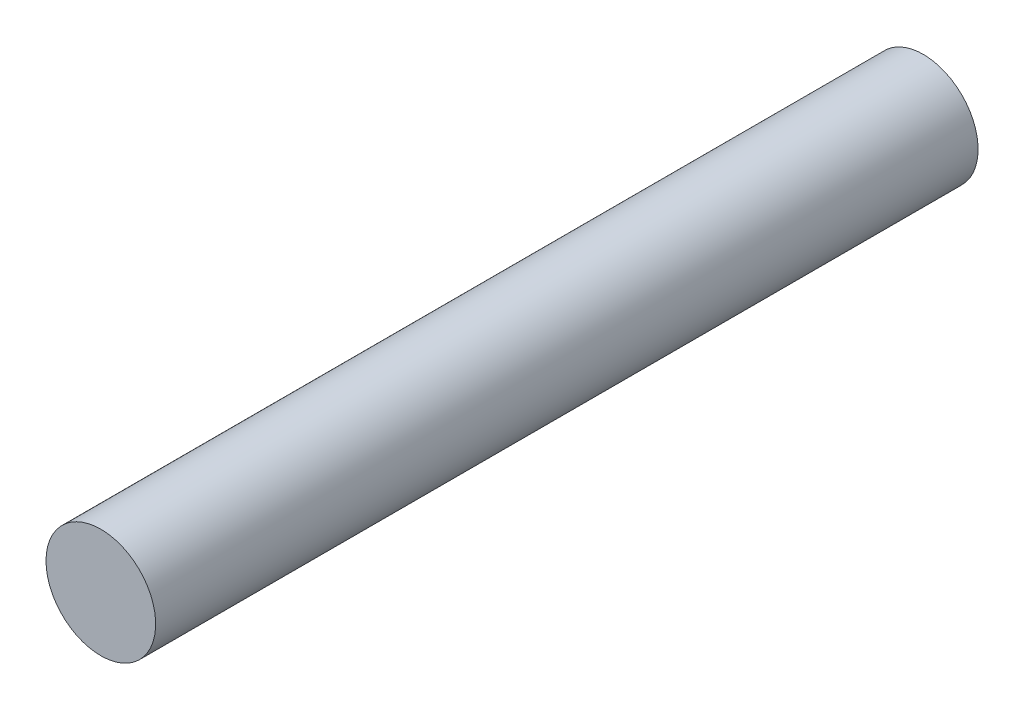
ISO-10303-21;
HEADER;
FILE_DESCRIPTION(('STEP AP214'),'2;1');
FILE_NAME('part.step','',(''),(''),'','','');
FILE_SCHEMA(('AUTOMOTIVE_DESIGN { 1 0 10303 214 1 1 1 1 }'));
ENDSEC;
DATA;
#1=APPLICATION_CONTEXT('core data for automotive mechanical design processes');
#2=APPLICATION_PROTOCOL_DEFINITION('international standard','automotive_design',2000,#1);
#3=PRODUCT_CONTEXT('',#1,'mechanical');
#4=PRODUCT('Part','Part','',(#3));
#5=PRODUCT_RELATED_PRODUCT_CATEGORY('part','',(#4));
#6=PRODUCT_DEFINITION_FORMATION('','',#4);
#7=PRODUCT_DEFINITION_CONTEXT('part definition',#1,'design');
#8=PRODUCT_DEFINITION('design','',#6,#7);
#9=PRODUCT_DEFINITION_SHAPE('','',#8);
#10=(LENGTH_UNIT() NAMED_UNIT(*) SI_UNIT(.MILLI.,.METRE.));
#11=(NAMED_UNIT(*) PLANE_ANGLE_UNIT() SI_UNIT($,.RADIAN.));
#12=(NAMED_UNIT(*) SI_UNIT($,.STERADIAN.) SOLID_ANGLE_UNIT());
#13=UNCERTAINTY_MEASURE_WITH_UNIT(LENGTH_MEASURE(1.E-05),#10,'distance_accuracy_value','');
#14=(GEOMETRIC_REPRESENTATION_CONTEXT(3) GLOBAL_UNCERTAINTY_ASSIGNED_CONTEXT((#13)) GLOBAL_UNIT_ASSIGNED_CONTEXT((#10,
#11,#12)) REPRESENTATION_CONTEXT('',''));
#15=CARTESIAN_POINT('',(0.,0.,0.));
#16=DIRECTION('',(0.,0.,1.));
#17=DIRECTION('',(1.,0.,0.));
#18=AXIS2_PLACEMENT_3D('',#15,#16,#17);
#19=CARTESIAN_POINT('',(0.,0.,45.));
#20=DIRECTION('',(0.,0.,-1.));
#21=DIRECTION('',(-1.,0.,0.));
#22=AXIS2_PLACEMENT_3D('',#19,#20,#21);
#23=CYLINDRICAL_SURFACE('',#22,3.);
#24=CARTESIAN_POINT('',(0.,0.,45.));
#25=DIRECTION('',(0.,0.,1.));
#26=DIRECTION('',(1.,0.,0.));
#27=AXIS2_PLACEMENT_3D('',#24,#25,#26);
#28=CIRCLE('',#27,3.);
#29=CARTESIAN_POINT('',(-3.,0.,45.));
#30=VERTEX_POINT('',#29);
#31=EDGE_CURVE('E10',#30,#30,#28,.T.);
#32=CARTESIAN_POINT('',(0.,0.,0.));
#33=DIRECTION('',(0.,0.,1.));
#34=DIRECTION('',(1.,0.,0.));
#35=AXIS2_PLACEMENT_3D('',#32,#33,#34);
#36=CIRCLE('',#35,3.);
#37=CARTESIAN_POINT('',(-3.,0.,0.));
#38=VERTEX_POINT('',#37);
#39=EDGE_CURVE('E35',#38,#38,#36,.T.);
#40=CARTESIAN_POINT('',(-3.,0.,45.));
#41=CARTESIAN_POINT('',(-3.,0.,44.53125));
#42=CARTESIAN_POINT('',(-3.,0.,44.0625));
#43=CARTESIAN_POINT('',(-3.,0.,43.125));
#44=CARTESIAN_POINT('',(-3.,0.,42.65625));
#45=CARTESIAN_POINT('',(-3.,0.,41.71875));
#46=CARTESIAN_POINT('',(-3.,0.,41.25));
#47=CARTESIAN_POINT('',(-3.,0.,40.3125));
#48=CARTESIAN_POINT('',(-3.,0.,39.84375));
#49=CARTESIAN_POINT('',(-3.,0.,38.90625));
#50=CARTESIAN_POINT('',(-3.,0.,38.4375));
#51=CARTESIAN_POINT('',(-3.,0.,37.5));
#52=CARTESIAN_POINT('',(-3.,0.,37.03125));
#53=CARTESIAN_POINT('',(-3.,0.,36.09375));
#54=CARTESIAN_POINT('',(-3.,0.,35.625));
#55=CARTESIAN_POINT('',(-3.,0.,34.6875));
#56=CARTESIAN_POINT('',(-3.,0.,34.21875));
#57=CARTESIAN_POINT('',(-3.,0.,33.28125));
#58=CARTESIAN_POINT('',(-3.,0.,32.8125));
#59=CARTESIAN_POINT('',(-3.,0.,31.875));
#60=CARTESIAN_POINT('',(-3.,0.,31.40625));
#61=CARTESIAN_POINT('',(-3.,0.,30.46875));
#62=CARTESIAN_POINT('',(-3.,0.,30.));
#63=CARTESIAN_POINT('',(-3.,0.,29.0625));
#64=CARTESIAN_POINT('',(-3.,0.,28.59375));
#65=CARTESIAN_POINT('',(-3.,0.,27.65625));
#66=CARTESIAN_POINT('',(-3.,0.,27.1875));
#67=CARTESIAN_POINT('',(-3.,0.,26.25));
#68=CARTESIAN_POINT('',(-3.,0.,25.78125));
#69=CARTESIAN_POINT('',(-3.,0.,24.84375));
#70=CARTESIAN_POINT('',(-3.,0.,24.375));
#71=CARTESIAN_POINT('',(-3.,0.,23.4375));
#72=CARTESIAN_POINT('',(-3.,0.,22.96875));
#73=CARTESIAN_POINT('',(-3.,0.,22.03125));
#74=CARTESIAN_POINT('',(-3.,0.,21.5625));
#75=CARTESIAN_POINT('',(-3.,0.,20.625));
#76=CARTESIAN_POINT('',(-3.,0.,20.15625));
#77=CARTESIAN_POINT('',(-3.,0.,19.21875));
#78=CARTESIAN_POINT('',(-3.,0.,18.75));
#79=CARTESIAN_POINT('',(-3.,0.,17.8125));
#80=CARTESIAN_POINT('',(-3.,0.,17.34375));
#81=CARTESIAN_POINT('',(-3.,0.,16.40625));
#82=CARTESIAN_POINT('',(-3.,0.,15.9375));
#83=CARTESIAN_POINT('',(-3.,0.,15.));
#84=CARTESIAN_POINT('',(-3.,0.,14.53125));
#85=CARTESIAN_POINT('',(-3.,0.,13.59375));
#86=CARTESIAN_POINT('',(-3.,0.,13.125));
#87=CARTESIAN_POINT('',(-3.,0.,12.1875));
#88=CARTESIAN_POINT('',(-3.,0.,11.71875));
#89=CARTESIAN_POINT('',(-3.,0.,10.78125));
#90=CARTESIAN_POINT('',(-3.,0.,10.3125));
#91=CARTESIAN_POINT('',(-3.,0.,9.375));
#92=CARTESIAN_POINT('',(-3.,0.,8.90625));
#93=CARTESIAN_POINT('',(-3.,0.,7.96874999999999));
#94=CARTESIAN_POINT('',(-3.,0.,7.5));
#95=CARTESIAN_POINT('',(-3.,0.,6.5625));
#96=CARTESIAN_POINT('',(-3.,0.,6.09375));
#97=CARTESIAN_POINT('',(-3.,0.,5.15625));
#98=CARTESIAN_POINT('',(-3.,0.,4.68749999999999));
#99=CARTESIAN_POINT('',(-3.,0.,3.74999999999999));
#100=CARTESIAN_POINT('',(-3.,0.,3.28124999999999));
#101=CARTESIAN_POINT('',(-3.,0.,2.34374999999999));
#102=CARTESIAN_POINT('',(-3.,0.,1.87499999999999));
#103=CARTESIAN_POINT('',(-3.,0.,0.937499999999992));
#104=CARTESIAN_POINT('',(-3.,0.,0.468749999999993));
#105=CARTESIAN_POINT('',(-3.,0.,0.));
#106=B_SPLINE_CURVE_WITH_KNOTS('',3,(#40,#41,#42,#43,#44,#45,#46,#47,#48,#49,#50,#51,#52,#53,
#54,#55,#56,#57,#58,#59,#60,#61,#62,#63,#64,#65,#66,#67,#68,#69,#70,#71,#72,#73,#74,#75,#76,#77,
#78,#79,#80,#81,#82,#83,#84,#85,#86,#87,#88,#89,#90,#91,#92,#93,#94,#95,#96,#97,#98,#99,#100,
#101,#102,#103,#104,#105),.UNSPECIFIED.,.F.,.F.,(4,2,2,2,2,2,2,2,2,2,2,2,2,2,2,2,2,2,2,2,2,2,2,
2,2,2,2,2,2,2,2,2,4),(0.,1.40625,2.8125,4.21875000000001,5.62500000000001,7.03125,8.4375,
9.84375000000001,11.25,12.65625,14.0625,15.46875,16.875,18.28125,19.6875,21.09375,22.5,23.90625,
25.3125,26.71875,28.125,29.53125,30.9375,32.34375,33.75,35.15625,36.5625,37.96875,39.375,
40.78125,42.1875,43.59375,45.),.UNSPECIFIED.);
#107=EDGE_CURVE('BSEAM32',#30,#38,#106,.T.);
#108=ORIENTED_EDGE('',*,*,#31,.F.);
#109=ORIENTED_EDGE('',*,*,#39,.T.);
#110=ORIENTED_EDGE('',*,*,#107,.T.);
#111=ORIENTED_EDGE('',*,*,#107,.F.);
#112=EDGE_LOOP('',(#108,#110,#109,#111));
#113=FACE_BOUND('',#112,.T.);
#114=ADVANCED_FACE('F32',(#113),#23,.T.);
#115=CARTESIAN_POINT('',(0.,0.,45.));
#116=DIRECTION('',(0.,0.,1.));
#117=DIRECTION('',(1.,0.,0.));
#118=AXIS2_PLACEMENT_3D('',#115,#116,#117);
#119=PLANE('',#118);
#120=ORIENTED_EDGE('',*,*,#31,.T.);
#121=EDGE_LOOP('',(#120));
#122=FACE_BOUND('',#121,.T.);
#123=ADVANCED_FACE('F47',(#122),#119,.T.);
#124=CARTESIAN_POINT('',(0.,0.,0.));
#125=DIRECTION('',(0.,0.,1.));
#126=DIRECTION('',(1.,0.,0.));
#127=AXIS2_PLACEMENT_3D('',#124,#125,#126);
#128=PLANE('',#127);
#129=ORIENTED_EDGE('',*,*,#39,.F.);
#130=EDGE_LOOP('',(#129));
#131=FACE_BOUND('',#130,.T.);
#132=ADVANCED_FACE('F45',(#131),#128,.F.);
#133=CLOSED_SHELL('',(#114,#123,#132));
#134=MANIFOLD_SOLID_BREP('B2',#133);
#135=ADVANCED_BREP_SHAPE_REPRESENTATION('',(#18,#134),#14);
#136=SHAPE_DEFINITION_REPRESENTATION(#9,#135);
ENDSEC;
END-ISO-10303-21;
